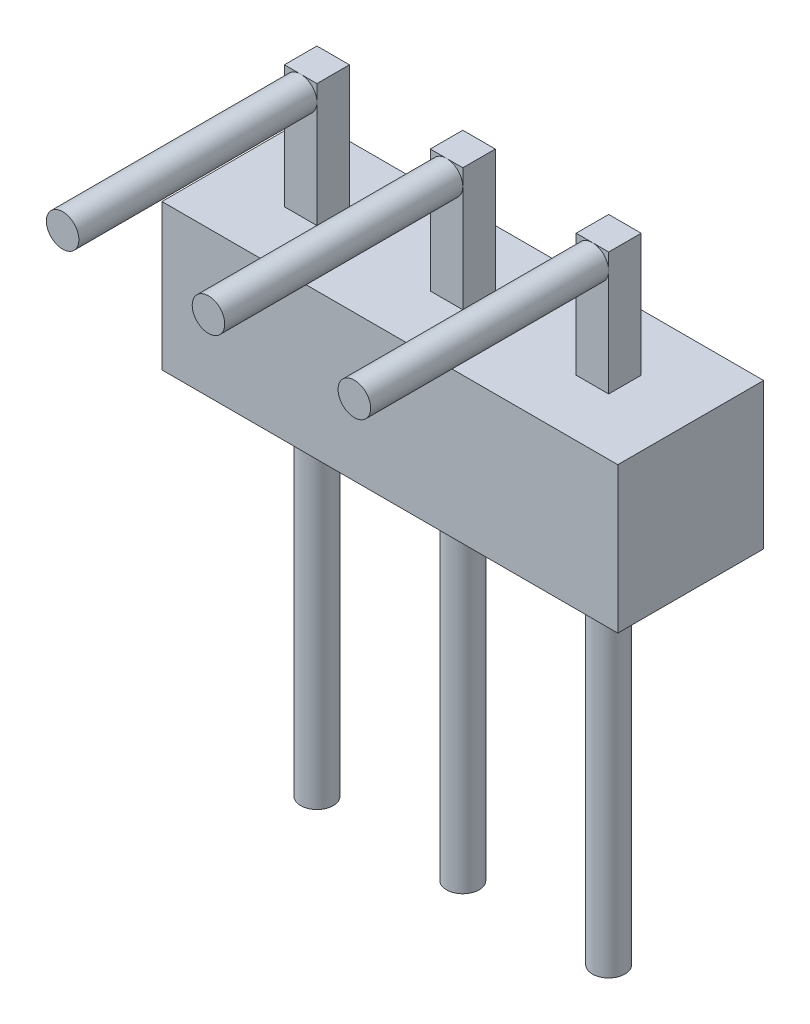
ISO-10303-21;
HEADER;
FILE_DESCRIPTION(('STEP AP214'),'2;1');
FILE_NAME('part.step','',(''),(''),'','','');
FILE_SCHEMA(('AUTOMOTIVE_DESIGN { 1 0 10303 214 1 1 1 1 }'));
ENDSEC;
DATA;
#1=APPLICATION_CONTEXT('core data for automotive mechanical design processes');
#2=APPLICATION_PROTOCOL_DEFINITION('international standard','automotive_design',2000,#1);
#3=PRODUCT_CONTEXT('',#1,'mechanical');
#4=PRODUCT('Part','Part','',(#3));
#5=PRODUCT_RELATED_PRODUCT_CATEGORY('part','',(#4));
#6=PRODUCT_DEFINITION_FORMATION('','',#4);
#7=PRODUCT_DEFINITION_CONTEXT('part definition',#1,'design');
#8=PRODUCT_DEFINITION('design','',#6,#7);
#9=PRODUCT_DEFINITION_SHAPE('','',#8);
#10=(LENGTH_UNIT() NAMED_UNIT(*) SI_UNIT(.MILLI.,.METRE.));
#11=(NAMED_UNIT(*) PLANE_ANGLE_UNIT() SI_UNIT($,.RADIAN.));
#12=(NAMED_UNIT(*) SI_UNIT($,.STERADIAN.) SOLID_ANGLE_UNIT());
#13=UNCERTAINTY_MEASURE_WITH_UNIT(LENGTH_MEASURE(1.E-05),#10,'distance_accuracy_value','');
#14=(GEOMETRIC_REPRESENTATION_CONTEXT(3) GLOBAL_UNCERTAINTY_ASSIGNED_CONTEXT((#13)) GLOBAL_UNIT_ASSIGNED_CONTEXT((#10,
#11,#12)) REPRESENTATION_CONTEXT('',''));
#15=CARTESIAN_POINT('',(0.,0.,0.));
#16=DIRECTION('',(0.,0.,1.));
#17=DIRECTION('',(1.,0.,0.));
#18=AXIS2_PLACEMENT_3D('',#15,#16,#17);
#19=CARTESIAN_POINT('',(2.54,3.12801,4.42849));
#20=DIRECTION('',(0.,0.,1.));
#21=DIRECTION('',(1.,0.,0.));
#22=AXIS2_PLACEMENT_3D('',#19,#20,#21);
#23=PLANE('',#22);
#24=CARTESIAN_POINT('',(2.54,3.12801,4.42849));
#25=DIRECTION('',(0.,0.,-1.));
#26=DIRECTION('',(-1.,0.,0.));
#27=AXIS2_PLACEMENT_3D('',#24,#25,#26);
#28=CIRCLE('',#27,0.28321);
#29=CARTESIAN_POINT('',(2.25679,3.12801,4.42849));
#30=VERTEX_POINT('',#29);
#31=EDGE_CURVE('E324',#30,#30,#28,.T.);
#32=ORIENTED_EDGE('',*,*,#31,.F.);
#33=EDGE_LOOP('',(#32));
#34=FACE_BOUND('',#33,.T.);
#35=ADVANCED_FACE('F17',(#34),#23,.T.);
#36=CARTESIAN_POINT('',(0.,3.12801,4.42849));
#37=DIRECTION('',(0.,0.,1.));
#38=DIRECTION('',(1.,0.,0.));
#39=AXIS2_PLACEMENT_3D('',#36,#37,#38);
#40=PLANE('',#39);
#41=CARTESIAN_POINT('',(0.,3.12801,4.42849));
#42=DIRECTION('',(0.,0.,-1.));
#43=DIRECTION('',(-1.,0.,0.));
#44=AXIS2_PLACEMENT_3D('',#41,#42,#43);
#45=CIRCLE('',#44,0.28321);
#46=CARTESIAN_POINT('',(-0.28321,3.12801,4.42849));
#47=VERTEX_POINT('',#46);
#48=EDGE_CURVE('E320',#47,#47,#45,.T.);
#49=ORIENTED_EDGE('',*,*,#48,.F.);
#50=EDGE_LOOP('',(#49));
#51=FACE_BOUND('',#50,.T.);
#52=ADVANCED_FACE('F595',(#51),#40,.T.);
#53=CARTESIAN_POINT('',(-2.54,3.12801,4.42849));
#54=DIRECTION('',(0.,0.,1.));
#55=DIRECTION('',(1.,0.,0.));
#56=AXIS2_PLACEMENT_3D('',#53,#54,#55);
#57=PLANE('',#56);
#58=CARTESIAN_POINT('',(-2.54,3.12801,4.42849));
#59=DIRECTION('',(0.,0.,-1.));
#60=DIRECTION('',(-1.,0.,0.));
#61=AXIS2_PLACEMENT_3D('',#58,#59,#60);
#62=CIRCLE('',#61,0.28321);
#63=CARTESIAN_POINT('',(-2.82321,3.12801,4.42849));
#64=VERTEX_POINT('',#63);
#65=EDGE_CURVE('E315',#64,#64,#62,.T.);
#66=ORIENTED_EDGE('',*,*,#65,.F.);
#67=EDGE_LOOP('',(#66));
#68=FACE_BOUND('',#67,.T.);
#69=ADVANCED_FACE('F593',(#68),#57,.T.);
#70=CARTESIAN_POINT('',(2.54,3.12801,4.42849));
#71=DIRECTION('',(0.,0.,-1.));
#72=DIRECTION('',(-1.,0.,0.));
#73=AXIS2_PLACEMENT_3D('',#70,#71,#72);
#74=CYLINDRICAL_SURFACE('',#73,0.28321);
#75=CARTESIAN_POINT('',(2.54,3.12801,0.28321));
#76=DIRECTION('',(0.,0.,-1.));
#77=DIRECTION('',(-1.,0.,0.));
#78=AXIS2_PLACEMENT_3D('',#75,#76,#77);
#79=CIRCLE('',#78,0.28321);
#80=CARTESIAN_POINT('',(2.25679,3.12801,0.28321));
#81=VERTEX_POINT('',#80);
#82=CARTESIAN_POINT('',(2.82321,3.12801,0.28321));
#83=VERTEX_POINT('',#82);
#84=EDGE_CURVE('E20',#81,#83,#79,.F.);
#85=ORIENTED_EDGE('',*,*,#84,.T.);
#86=CARTESIAN_POINT('',(2.54,3.12801,0.28321));
#87=DIRECTION('',(0.,0.,-1.));
#88=DIRECTION('',(-1.,0.,0.));
#89=AXIS2_PLACEMENT_3D('',#86,#87,#88);
#90=CIRCLE('',#89,0.28321);
#91=CARTESIAN_POINT('',(2.54,3.41122,0.28321));
#92=VERTEX_POINT('',#91);
#93=EDGE_CURVE('E171',#83,#92,#90,.F.);
#94=ORIENTED_EDGE('',*,*,#93,.T.);
#95=CARTESIAN_POINT('',(2.54,3.12801,0.28321));
#96=DIRECTION('',(0.,0.,-1.));
#97=DIRECTION('',(-1.,0.,0.));
#98=AXIS2_PLACEMENT_3D('',#95,#96,#97);
#99=CIRCLE('',#98,0.28321);
#100=EDGE_CURVE('E166',#92,#81,#99,.F.);
#101=ORIENTED_EDGE('',*,*,#100,.T.);
#102=EDGE_LOOP('',(#85,#94,#101));
#103=FACE_BOUND('',#102,.T.);
#104=ORIENTED_EDGE('',*,*,#31,.T.);
#105=EDGE_LOOP('',(#104));
#106=FACE_BOUND('',#105,.T.);
#107=ADVANCED_FACE('F168',(#103,#106),#74,.T.);
#108=CARTESIAN_POINT('',(0.,3.12801,4.42849));
#109=DIRECTION('',(0.,0.,-1.));
#110=DIRECTION('',(-1.,0.,0.));
#111=AXIS2_PLACEMENT_3D('',#108,#109,#110);
#112=CYLINDRICAL_SURFACE('',#111,0.28321);
#113=CARTESIAN_POINT('',(0.,3.12801,0.28321));
#114=DIRECTION('',(0.,0.,-1.));
#115=DIRECTION('',(-1.,0.,0.));
#116=AXIS2_PLACEMENT_3D('',#113,#114,#115);
#117=CIRCLE('',#116,0.28321);
#118=CARTESIAN_POINT('',(-0.28321,3.12801,0.28321));
#119=VERTEX_POINT('',#118);
#120=CARTESIAN_POINT('',(0.28321,3.12801,0.28321));
#121=VERTEX_POINT('',#120);
#122=EDGE_CURVE('E164',#119,#121,#117,.F.);
#123=ORIENTED_EDGE('',*,*,#122,.T.);
#124=CARTESIAN_POINT('',(0.,3.12801,0.28321));
#125=DIRECTION('',(0.,0.,-1.));
#126=DIRECTION('',(-1.,0.,0.));
#127=AXIS2_PLACEMENT_3D('',#124,#125,#126);
#128=CIRCLE('',#127,0.28321);
#129=CARTESIAN_POINT('',(0.,3.41122,0.28321));
#130=VERTEX_POINT('',#129);
#131=EDGE_CURVE('E318',#121,#130,#128,.F.);
#132=ORIENTED_EDGE('',*,*,#131,.T.);
#133=CARTESIAN_POINT('',(0.,3.12801,0.28321));
#134=DIRECTION('',(0.,0.,-1.));
#135=DIRECTION('',(-1.,0.,0.));
#136=AXIS2_PLACEMENT_3D('',#133,#134,#135);
#137=CIRCLE('',#136,0.28321);
#138=EDGE_CURVE('E242',#130,#119,#137,.F.);
#139=ORIENTED_EDGE('',*,*,#138,.T.);
#140=EDGE_LOOP('',(#123,#132,#139));
#141=FACE_BOUND('',#140,.T.);
#142=ORIENTED_EDGE('',*,*,#48,.T.);
#143=EDGE_LOOP('',(#142));
#144=FACE_BOUND('',#143,.T.);
#145=ADVANCED_FACE('F330',(#141,#144),#112,.T.);
#146=CARTESIAN_POINT('',(-2.54,3.12801,4.42849));
#147=DIRECTION('',(0.,0.,-1.));
#148=DIRECTION('',(-1.,0.,0.));
#149=AXIS2_PLACEMENT_3D('',#146,#147,#148);
#150=CYLINDRICAL_SURFACE('',#149,0.28321);
#151=CARTESIAN_POINT('',(-2.54,3.12801,0.28321));
#152=DIRECTION('',(0.,0.,-1.));
#153=DIRECTION('',(-1.,0.,0.));
#154=AXIS2_PLACEMENT_3D('',#151,#152,#153);
#155=CIRCLE('',#154,0.28321);
#156=CARTESIAN_POINT('',(-2.82321,3.12801,0.28321));
#157=VERTEX_POINT('',#156);
#158=CARTESIAN_POINT('',(-2.25679,3.12801,0.28321));
#159=VERTEX_POINT('',#158);
#160=EDGE_CURVE('E327',#157,#159,#155,.F.);
#161=ORIENTED_EDGE('',*,*,#160,.T.);
#162=CARTESIAN_POINT('',(-2.54,3.12801,0.28321));
#163=DIRECTION('',(0.,0.,-1.));
#164=DIRECTION('',(-1.,0.,0.));
#165=AXIS2_PLACEMENT_3D('',#162,#163,#164);
#166=CIRCLE('',#165,0.28321);
#167=CARTESIAN_POINT('',(-2.54,3.41122,0.28321));
#168=VERTEX_POINT('',#167);
#169=EDGE_CURVE('E176',#159,#168,#166,.F.);
#170=ORIENTED_EDGE('',*,*,#169,.T.);
#171=CARTESIAN_POINT('',(-2.54,3.12801,0.28321));
#172=DIRECTION('',(0.,0.,-1.));
#173=DIRECTION('',(-1.,0.,0.));
#174=AXIS2_PLACEMENT_3D('',#171,#172,#173);
#175=CIRCLE('',#174,0.28321);
#176=EDGE_CURVE('E221',#168,#157,#175,.F.);
#177=ORIENTED_EDGE('',*,*,#176,.T.);
#178=EDGE_LOOP('',(#161,#170,#177));
#179=FACE_BOUND('',#178,.T.);
#180=ORIENTED_EDGE('',*,*,#65,.T.);
#181=EDGE_LOOP('',(#180));
#182=FACE_BOUND('',#181,.T.);
#183=ADVANCED_FACE('F587',(#179,#182),#150,.T.);
#184=CARTESIAN_POINT('',(2.25679,3.41122,0.28321));
#185=DIRECTION('',(0.,0.,-1.));
#186=DIRECTION('',(-1.,0.,0.));
#187=AXIS2_PLACEMENT_3D('',#184,#185,#186);
#188=PLANE('',#187);
#189=DIRECTION('',(1.,0.,0.));
#190=VECTOR('',#189,1.);
#191=CARTESIAN_POINT('',(2.82321,3.41122,0.28321));
#192=LINE('',#191,#190);
#193=CARTESIAN_POINT('',(2.25679,3.41122,0.28321));
#194=VERTEX_POINT('',#193);
#195=EDGE_CURVE('E179',#92,#194,#192,.F.);
#196=ORIENTED_EDGE('',*,*,#195,.T.);
#197=DIRECTION('',(0.,1.,0.));
#198=VECTOR('',#197,1.);
#199=CARTESIAN_POINT('',(2.25679,3.41122,0.28321));
#200=LINE('',#199,#198);
#201=EDGE_CURVE('E175',#194,#81,#200,.F.);
#202=ORIENTED_EDGE('',*,*,#201,.T.);
#203=ORIENTED_EDGE('',*,*,#100,.F.);
#204=EDGE_LOOP('',(#196,#202,#203));
#205=FACE_BOUND('',#204,.T.);
#206=ADVANCED_FACE('F178',(#205),#188,.F.);
#207=CARTESIAN_POINT('',(2.25679,3.41122,0.28321));
#208=DIRECTION('',(1.,0.,0.));
#209=DIRECTION('',(0.,0.,-1.));
#210=AXIS2_PLACEMENT_3D('',#207,#208,#209);
#211=PLANE('',#210);
#212=DIRECTION('',(0.,1.,0.));
#213=VECTOR('',#212,1.);
#214=CARTESIAN_POINT('',(2.25679,3.41122,0.28321));
#215=LINE('',#214,#213);
#216=CARTESIAN_POINT('',(2.25679,1.27,0.28321));
#217=VERTEX_POINT('',#216);
#218=EDGE_CURVE('E158',#217,#81,#215,.T.);
#219=ORIENTED_EDGE('',*,*,#218,.T.);
#220=ORIENTED_EDGE('',*,*,#201,.F.);
#221=DIRECTION('',(0.,0.,-1.));
#222=VECTOR('',#221,1.);
#223=CARTESIAN_POINT('',(2.25679,3.41122,-0.28321));
#224=LINE('',#223,#222);
#225=CARTESIAN_POINT('',(2.25679,3.41122,-0.28321));
#226=VERTEX_POINT('',#225);
#227=EDGE_CURVE('E249',#194,#226,#224,.T.);
#228=ORIENTED_EDGE('',*,*,#227,.T.);
#229=DIRECTION('',(0.,1.,0.));
#230=VECTOR('',#229,1.);
#231=CARTESIAN_POINT('',(2.25679,3.41122,-0.28321));
#232=LINE('',#231,#230);
#233=CARTESIAN_POINT('',(2.25679,1.27,-0.28321));
#234=VERTEX_POINT('',#233);
#235=EDGE_CURVE('E284',#226,#234,#232,.F.);
#236=ORIENTED_EDGE('',*,*,#235,.T.);
#237=DIRECTION('',(0.,0.,-1.));
#238=VECTOR('',#237,1.);
#239=CARTESIAN_POINT('',(2.25679,1.27,0.28321));
#240=LINE('',#239,#238);
#241=EDGE_CURVE('E182',#217,#234,#240,.T.);
#242=ORIENTED_EDGE('',*,*,#241,.F.);
#243=EDGE_LOOP('',(#219,#220,#228,#236,#242));
#244=FACE_BOUND('',#243,.T.);
#245=ADVANCED_FACE('F184',(#244),#211,.F.);
#246=CARTESIAN_POINT('',(-0.28321,3.41122,0.28321));
#247=DIRECTION('',(0.,0.,-1.));
#248=DIRECTION('',(-1.,0.,0.));
#249=AXIS2_PLACEMENT_3D('',#246,#247,#248);
#250=PLANE('',#249);
#251=DIRECTION('',(1.,0.,0.));
#252=VECTOR('',#251,1.);
#253=CARTESIAN_POINT('',(0.28321,3.41122,0.28321));
#254=LINE('',#253,#252);
#255=CARTESIAN_POINT('',(-0.28321,3.41122,0.28321));
#256=VERTEX_POINT('',#255);
#257=EDGE_CURVE('E227',#130,#256,#254,.F.);
#258=ORIENTED_EDGE('',*,*,#257,.T.);
#259=DIRECTION('',(0.,1.,0.));
#260=VECTOR('',#259,1.);
#261=CARTESIAN_POINT('',(-0.28321,3.41122,0.28321));
#262=LINE('',#261,#260);
#263=EDGE_CURVE('E238',#256,#119,#262,.F.);
#264=ORIENTED_EDGE('',*,*,#263,.T.);
#265=ORIENTED_EDGE('',*,*,#138,.F.);
#266=EDGE_LOOP('',(#258,#264,#265));
#267=FACE_BOUND('',#266,.T.);
#268=ADVANCED_FACE('F458',(#267),#250,.F.);
#269=CARTESIAN_POINT('',(-0.28321,3.41122,0.28321));
#270=DIRECTION('',(1.,0.,0.));
#271=DIRECTION('',(0.,0.,-1.));
#272=AXIS2_PLACEMENT_3D('',#269,#270,#271);
#273=PLANE('',#272);
#274=DIRECTION('',(0.,1.,0.));
#275=VECTOR('',#274,1.);
#276=CARTESIAN_POINT('',(-0.28321,3.41122,0.28321));
#277=LINE('',#276,#275);
#278=CARTESIAN_POINT('',(-0.28321,1.27,0.28321));
#279=VERTEX_POINT('',#278);
#280=EDGE_CURVE('E359',#279,#119,#277,.T.);
#281=ORIENTED_EDGE('',*,*,#280,.T.);
#282=ORIENTED_EDGE('',*,*,#263,.F.);
#283=DIRECTION('',(0.,0.,-1.));
#284=VECTOR('',#283,1.);
#285=CARTESIAN_POINT('',(-0.28321,3.41122,-0.28321));
#286=LINE('',#285,#284);
#287=CARTESIAN_POINT('',(-0.28321,3.41122,-0.28321));
#288=VERTEX_POINT('',#287);
#289=EDGE_CURVE('E230',#256,#288,#286,.T.);
#290=ORIENTED_EDGE('',*,*,#289,.T.);
#291=DIRECTION('',(0.,1.,0.));
#292=VECTOR('',#291,1.);
#293=CARTESIAN_POINT('',(-0.28321,3.41122,-0.28321));
#294=LINE('',#293,#292);
#295=CARTESIAN_POINT('',(-0.28321,1.27,-0.28321));
#296=VERTEX_POINT('',#295);
#297=EDGE_CURVE('E274',#288,#296,#294,.F.);
#298=ORIENTED_EDGE('',*,*,#297,.T.);
#299=DIRECTION('',(0.,0.,-1.));
#300=VECTOR('',#299,1.);
#301=CARTESIAN_POINT('',(-0.28321,1.27,0.28321));
#302=LINE('',#301,#300);
#303=EDGE_CURVE('E241',#279,#296,#302,.T.);
#304=ORIENTED_EDGE('',*,*,#303,.F.);
#305=EDGE_LOOP('',(#281,#282,#290,#298,#304));
#306=FACE_BOUND('',#305,.T.);
#307=ADVANCED_FACE('F454',(#306),#273,.F.);
#308=CARTESIAN_POINT('',(-2.82321,3.41122,0.28321));
#309=DIRECTION('',(0.,0.,-1.));
#310=DIRECTION('',(-1.,0.,0.));
#311=AXIS2_PLACEMENT_3D('',#308,#309,#310);
#312=PLANE('',#311);
#313=DIRECTION('',(1.,0.,0.));
#314=VECTOR('',#313,1.);
#315=CARTESIAN_POINT('',(-2.25679,3.41122,0.28321));
#316=LINE('',#315,#314);
#317=CARTESIAN_POINT('',(-2.82321,3.41122,0.28321));
#318=VERTEX_POINT('',#317);
#319=EDGE_CURVE('E207',#168,#318,#316,.F.);
#320=ORIENTED_EDGE('',*,*,#319,.T.);
#321=DIRECTION('',(0.,1.,0.));
#322=VECTOR('',#321,1.);
#323=CARTESIAN_POINT('',(-2.82321,3.41122,0.28321));
#324=LINE('',#323,#322);
#325=EDGE_CURVE('E218',#318,#157,#324,.F.);
#326=ORIENTED_EDGE('',*,*,#325,.T.);
#327=ORIENTED_EDGE('',*,*,#176,.F.);
#328=EDGE_LOOP('',(#320,#326,#327));
#329=FACE_BOUND('',#328,.T.);
#330=ADVANCED_FACE('F466',(#329),#312,.F.);
#331=CARTESIAN_POINT('',(-2.82321,3.41122,0.28321));
#332=DIRECTION('',(1.,0.,0.));
#333=DIRECTION('',(0.,0.,-1.));
#334=AXIS2_PLACEMENT_3D('',#331,#332,#333);
#335=PLANE('',#334);
#336=DIRECTION('',(0.,1.,0.));
#337=VECTOR('',#336,1.);
#338=CARTESIAN_POINT('',(-2.82321,3.41122,0.28321));
#339=LINE('',#338,#337);
#340=CARTESIAN_POINT('',(-2.82321,1.27,0.28321));
#341=VERTEX_POINT('',#340);
#342=EDGE_CURVE('E424',#341,#157,#339,.T.);
#343=ORIENTED_EDGE('',*,*,#342,.T.);
#344=ORIENTED_EDGE('',*,*,#325,.F.);
#345=DIRECTION('',(0.,0.,-1.));
#346=VECTOR('',#345,1.);
#347=CARTESIAN_POINT('',(-2.82321,3.41122,-0.28321));
#348=LINE('',#347,#346);
#349=CARTESIAN_POINT('',(-2.82321,3.41122,-0.28321));
#350=VERTEX_POINT('',#349);
#351=EDGE_CURVE('E210',#318,#350,#348,.T.);
#352=ORIENTED_EDGE('',*,*,#351,.T.);
#353=DIRECTION('',(0.,1.,0.));
#354=VECTOR('',#353,1.);
#355=CARTESIAN_POINT('',(-2.82321,3.41122,-0.28321));
#356=LINE('',#355,#354);
#357=CARTESIAN_POINT('',(-2.82321,1.27,-0.28321));
#358=VERTEX_POINT('',#357);
#359=EDGE_CURVE('E264',#350,#358,#356,.F.);
#360=ORIENTED_EDGE('',*,*,#359,.T.);
#361=DIRECTION('',(0.,0.,-1.));
#362=VECTOR('',#361,1.);
#363=CARTESIAN_POINT('',(-2.82321,1.27,0.28321));
#364=LINE('',#363,#362);
#365=EDGE_CURVE('E191',#341,#358,#364,.T.);
#366=ORIENTED_EDGE('',*,*,#365,.F.);
#367=EDGE_LOOP('',(#343,#344,#352,#360,#366));
#368=FACE_BOUND('',#367,.T.);
#369=ADVANCED_FACE('F564',(#368),#335,.F.);
#370=CARTESIAN_POINT('',(0.,-7.62,0.));
#371=DIRECTION('',(0.,-1.,0.));
#372=DIRECTION('',(0.,0.,-1.));
#373=AXIS2_PLACEMENT_3D('',#370,#371,#372);
#374=PLANE('',#373);
#375=CARTESIAN_POINT('',(0.,-7.62,0.));
#376=DIRECTION('',(0.,1.,0.));
#377=DIRECTION('',(0.,0.,1.));
#378=AXIS2_PLACEMENT_3D('',#375,#376,#377);
#379=CIRCLE('',#378,0.28321);
#380=CARTESIAN_POINT('',(0.,-7.62,0.28321));
#381=VERTEX_POINT('',#380);
#382=EDGE_CURVE('E263',#381,#381,#379,.T.);
#383=ORIENTED_EDGE('',*,*,#382,.F.);
#384=EDGE_LOOP('',(#383));
#385=FACE_BOUND('',#384,.T.);
#386=ADVANCED_FACE('F560',(#385),#374,.T.);
#387=CARTESIAN_POINT('',(-2.54,-7.62,0.));
#388=DIRECTION('',(0.,-1.,0.));
#389=DIRECTION('',(0.,0.,-1.));
#390=AXIS2_PLACEMENT_3D('',#387,#388,#389);
#391=PLANE('',#390);
#392=CARTESIAN_POINT('',(-2.54,-7.62,0.));
#393=DIRECTION('',(0.,1.,0.));
#394=DIRECTION('',(0.,0.,1.));
#395=AXIS2_PLACEMENT_3D('',#392,#393,#394);
#396=CIRCLE('',#395,0.28321);
#397=CARTESIAN_POINT('',(-2.54,-7.62,0.28321));
#398=VERTEX_POINT('',#397);
#399=EDGE_CURVE('E305',#398,#398,#396,.T.);
#400=ORIENTED_EDGE('',*,*,#399,.F.);
#401=EDGE_LOOP('',(#400));
#402=FACE_BOUND('',#401,.T.);
#403=ADVANCED_FACE('F556',(#402),#391,.T.);
#404=CARTESIAN_POINT('',(2.54,-7.62,0.));
#405=DIRECTION('',(0.,-1.,0.));
#406=DIRECTION('',(0.,0.,-1.));
#407=AXIS2_PLACEMENT_3D('',#404,#405,#406);
#408=PLANE('',#407);
#409=CARTESIAN_POINT('',(2.54,-7.62,0.));
#410=DIRECTION('',(0.,1.,0.));
#411=DIRECTION('',(0.,0.,1.));
#412=AXIS2_PLACEMENT_3D('',#409,#410,#411);
#413=CIRCLE('',#412,0.28321);
#414=CARTESIAN_POINT('',(2.54,-7.62,0.28321));
#415=VERTEX_POINT('',#414);
#416=EDGE_CURVE('E302',#415,#415,#413,.T.);
#417=ORIENTED_EDGE('',*,*,#416,.F.);
#418=EDGE_LOOP('',(#417));
#419=FACE_BOUND('',#418,.T.);
#420=ADVANCED_FACE('F553',(#419),#408,.T.);
#421=CARTESIAN_POINT('',(2.25679,3.41122,0.28321));
#422=DIRECTION('',(0.,0.,-1.));
#423=DIRECTION('',(-1.,0.,0.));
#424=AXIS2_PLACEMENT_3D('',#421,#422,#423);
#425=PLANE('',#424);
#426=ORIENTED_EDGE('',*,*,#218,.F.);
#427=DIRECTION('',(-1.,0.,0.));
#428=VECTOR('',#427,1.);
#429=CARTESIAN_POINT('',(2.25679,1.27,0.28321));
#430=LINE('',#429,#428);
#431=CARTESIAN_POINT('',(2.82321,1.27,0.28321));
#432=VERTEX_POINT('',#431);
#433=EDGE_CURVE('E187',#432,#217,#430,.T.);
#434=ORIENTED_EDGE('',*,*,#433,.F.);
#435=DIRECTION('',(0.,1.,0.));
#436=VECTOR('',#435,1.);
#437=CARTESIAN_POINT('',(2.82321,3.41122,0.28321));
#438=LINE('',#437,#436);
#439=EDGE_CURVE('E161',#432,#83,#438,.T.);
#440=ORIENTED_EDGE('',*,*,#439,.T.);
#441=ORIENTED_EDGE('',*,*,#84,.F.);
#442=EDGE_LOOP('',(#426,#434,#440,#441));
#443=FACE_BOUND('',#442,.T.);
#444=ADVANCED_FACE('F156',(#443),#425,.F.);
#445=CARTESIAN_POINT('',(2.25679,3.41122,0.28321));
#446=DIRECTION('',(0.,0.,-1.));
#447=DIRECTION('',(-1.,0.,0.));
#448=AXIS2_PLACEMENT_3D('',#445,#446,#447);
#449=PLANE('',#448);
#450=DIRECTION('',(0.,1.,0.));
#451=VECTOR('',#450,1.);
#452=CARTESIAN_POINT('',(2.82321,3.41122,0.28321));
#453=LINE('',#452,#451);
#454=CARTESIAN_POINT('',(2.82321,3.41122,0.28321));
#455=VERTEX_POINT('',#454);
#456=EDGE_CURVE('E383',#83,#455,#453,.T.);
#457=ORIENTED_EDGE('',*,*,#456,.T.);
#458=DIRECTION('',(1.,0.,0.));
#459=VECTOR('',#458,1.);
#460=CARTESIAN_POINT('',(2.82321,3.41122,0.28321));
#461=LINE('',#460,#459);
#462=EDGE_CURVE('E186',#455,#92,#461,.F.);
#463=ORIENTED_EDGE('',*,*,#462,.T.);
#464=ORIENTED_EDGE('',*,*,#93,.F.);
#465=EDGE_LOOP('',(#457,#463,#464));
#466=FACE_BOUND('',#465,.T.);
#467=ADVANCED_FACE('F547',(#466),#449,.F.);
#468=CARTESIAN_POINT('',(2.82321,3.41122,-0.28321));
#469=DIRECTION('',(0.,-1.,0.));
#470=DIRECTION('',(0.,0.,-1.));
#471=AXIS2_PLACEMENT_3D('',#468,#469,#470);
#472=PLANE('',#471);
#473=DIRECTION('',(1.,0.,0.));
#474=VECTOR('',#473,1.);
#475=CARTESIAN_POINT('',(2.25679,3.41122,-0.28321));
#476=LINE('',#475,#474);
#477=CARTESIAN_POINT('',(2.82321,3.41122,-0.28321));
#478=VERTEX_POINT('',#477);
#479=EDGE_CURVE('E253',#478,#226,#476,.F.);
#480=ORIENTED_EDGE('',*,*,#479,.T.);
#481=ORIENTED_EDGE('',*,*,#227,.F.);
#482=ORIENTED_EDGE('',*,*,#195,.F.);
#483=ORIENTED_EDGE('',*,*,#462,.F.);
#484=DIRECTION('',(0.,0.,1.));
#485=VECTOR('',#484,1.);
#486=CARTESIAN_POINT('',(2.82321,3.41122,0.28321));
#487=LINE('',#486,#485);
#488=EDGE_CURVE('E388',#455,#478,#487,.F.);
#489=ORIENTED_EDGE('',*,*,#488,.T.);
#490=EDGE_LOOP('',(#480,#481,#482,#483,#489));
#491=FACE_BOUND('',#490,.T.);
#492=ADVANCED_FACE('F544',(#491),#472,.F.);
#493=CARTESIAN_POINT('',(2.25679,3.41122,-0.28321));
#494=DIRECTION('',(0.,0.,1.));
#495=DIRECTION('',(1.,0.,0.));
#496=AXIS2_PLACEMENT_3D('',#493,#494,#495);
#497=PLANE('',#496);
#498=ORIENTED_EDGE('',*,*,#235,.F.);
#499=ORIENTED_EDGE('',*,*,#479,.F.);
#500=DIRECTION('',(0.,1.,0.));
#501=VECTOR('',#500,1.);
#502=CARTESIAN_POINT('',(2.82321,3.41122,-0.28321));
#503=LINE('',#502,#501);
#504=CARTESIAN_POINT('',(2.82321,1.27,-0.28321));
#505=VERTEX_POINT('',#504);
#506=EDGE_CURVE('E345',#478,#505,#503,.F.);
#507=ORIENTED_EDGE('',*,*,#506,.T.);
#508=DIRECTION('',(1.,0.,0.));
#509=VECTOR('',#508,1.);
#510=CARTESIAN_POINT('',(2.25679,1.27,-0.28321));
#511=LINE('',#510,#509);
#512=EDGE_CURVE('E281',#234,#505,#511,.T.);
#513=ORIENTED_EDGE('',*,*,#512,.F.);
#514=EDGE_LOOP('',(#498,#499,#507,#513));
#515=FACE_BOUND('',#514,.T.);
#516=ADVANCED_FACE('F541',(#515),#497,.F.);
#517=CARTESIAN_POINT('',(-0.28321,3.41122,0.28321));
#518=DIRECTION('',(0.,0.,-1.));
#519=DIRECTION('',(-1.,0.,0.));
#520=AXIS2_PLACEMENT_3D('',#517,#518,#519);
#521=PLANE('',#520);
#522=ORIENTED_EDGE('',*,*,#280,.F.);
#523=DIRECTION('',(-1.,0.,0.));
#524=VECTOR('',#523,1.);
#525=CARTESIAN_POINT('',(-0.28321,1.27,0.28321));
#526=LINE('',#525,#524);
#527=CARTESIAN_POINT('',(0.28321,1.27,0.28321));
#528=VERTEX_POINT('',#527);
#529=EDGE_CURVE('E283',#528,#279,#526,.T.);
#530=ORIENTED_EDGE('',*,*,#529,.F.);
#531=DIRECTION('',(0.,1.,0.));
#532=VECTOR('',#531,1.);
#533=CARTESIAN_POINT('',(0.28321,3.41122,0.28321));
#534=LINE('',#533,#532);
#535=EDGE_CURVE('E337',#528,#121,#534,.T.);
#536=ORIENTED_EDGE('',*,*,#535,.T.);
#537=ORIENTED_EDGE('',*,*,#122,.F.);
#538=EDGE_LOOP('',(#522,#530,#536,#537));
#539=FACE_BOUND('',#538,.T.);
#540=ADVANCED_FACE('F339',(#539),#521,.F.);
#541=CARTESIAN_POINT('',(-0.28321,3.41122,0.28321));
#542=DIRECTION('',(0.,0.,-1.));
#543=DIRECTION('',(-1.,0.,0.));
#544=AXIS2_PLACEMENT_3D('',#541,#542,#543);
#545=PLANE('',#544);
#546=DIRECTION('',(0.,1.,0.));
#547=VECTOR('',#546,1.);
#548=CARTESIAN_POINT('',(0.28321,3.41122,0.28321));
#549=LINE('',#548,#547);
#550=CARTESIAN_POINT('',(0.28321,3.41122,0.28321));
#551=VERTEX_POINT('',#550);
#552=EDGE_CURVE('E344',#121,#551,#549,.T.);
#553=ORIENTED_EDGE('',*,*,#552,.T.);
#554=DIRECTION('',(1.,0.,0.));
#555=VECTOR('',#554,1.);
#556=CARTESIAN_POINT('',(0.28321,3.41122,0.28321));
#557=LINE('',#556,#555);
#558=EDGE_CURVE('E231',#551,#130,#557,.F.);
#559=ORIENTED_EDGE('',*,*,#558,.T.);
#560=ORIENTED_EDGE('',*,*,#131,.F.);
#561=EDGE_LOOP('',(#553,#559,#560));
#562=FACE_BOUND('',#561,.T.);
#563=ADVANCED_FACE('F356',(#562),#545,.F.);
#564=CARTESIAN_POINT('',(0.28321,3.41122,-0.28321));
#565=DIRECTION('',(0.,-1.,0.));
#566=DIRECTION('',(0.,0.,-1.));
#567=AXIS2_PLACEMENT_3D('',#564,#565,#566);
#568=PLANE('',#567);
#569=DIRECTION('',(1.,0.,0.));
#570=VECTOR('',#569,1.);
#571=CARTESIAN_POINT('',(-0.28321,3.41122,-0.28321));
#572=LINE('',#571,#570);
#573=CARTESIAN_POINT('',(0.28321,3.41122,-0.28321));
#574=VERTEX_POINT('',#573);
#575=EDGE_CURVE('E235',#574,#288,#572,.F.);
#576=ORIENTED_EDGE('',*,*,#575,.T.);
#577=ORIENTED_EDGE('',*,*,#289,.F.);
#578=ORIENTED_EDGE('',*,*,#257,.F.);
#579=ORIENTED_EDGE('',*,*,#558,.F.);
#580=DIRECTION('',(0.,0.,1.));
#581=VECTOR('',#580,1.);
#582=CARTESIAN_POINT('',(0.28321,3.41122,0.28321));
#583=LINE('',#582,#581);
#584=EDGE_CURVE('E352',#551,#574,#583,.F.);
#585=ORIENTED_EDGE('',*,*,#584,.T.);
#586=EDGE_LOOP('',(#576,#577,#578,#579,#585));
#587=FACE_BOUND('',#586,.T.);
#588=ADVANCED_FACE('F456',(#587),#568,.F.);
#589=CARTESIAN_POINT('',(-0.28321,3.41122,-0.28321));
#590=DIRECTION('',(0.,0.,1.));
#591=DIRECTION('',(1.,0.,0.));
#592=AXIS2_PLACEMENT_3D('',#589,#590,#591);
#593=PLANE('',#592);
#594=ORIENTED_EDGE('',*,*,#297,.F.);
#595=ORIENTED_EDGE('',*,*,#575,.F.);
#596=DIRECTION('',(0.,1.,0.));
#597=VECTOR('',#596,1.);
#598=CARTESIAN_POINT('',(0.28321,3.41122,-0.28321));
#599=LINE('',#598,#597);
#600=CARTESIAN_POINT('',(0.28321,1.27,-0.28321));
#601=VERTEX_POINT('',#600);
#602=EDGE_CURVE('E403',#574,#601,#599,.F.);
#603=ORIENTED_EDGE('',*,*,#602,.T.);
#604=DIRECTION('',(1.,0.,0.));
#605=VECTOR('',#604,1.);
#606=CARTESIAN_POINT('',(-0.28321,1.27,-0.28321));
#607=LINE('',#606,#605);
#608=EDGE_CURVE('E271',#296,#601,#607,.T.);
#609=ORIENTED_EDGE('',*,*,#608,.F.);
#610=EDGE_LOOP('',(#594,#595,#603,#609));
#611=FACE_BOUND('',#610,.T.);
#612=ADVANCED_FACE('F449',(#611),#593,.F.);
#613=CARTESIAN_POINT('',(-2.82321,3.41122,0.28321));
#614=DIRECTION('',(0.,0.,-1.));
#615=DIRECTION('',(-1.,0.,0.));
#616=AXIS2_PLACEMENT_3D('',#613,#614,#615);
#617=PLANE('',#616);
#618=ORIENTED_EDGE('',*,*,#342,.F.);
#619=DIRECTION('',(-1.,0.,0.));
#620=VECTOR('',#619,1.);
#621=CARTESIAN_POINT('',(-2.82321,1.27,0.28321));
#622=LINE('',#621,#620);
#623=CARTESIAN_POINT('',(-2.25679,1.27,0.28321));
#624=VERTEX_POINT('',#623);
#625=EDGE_CURVE('E273',#624,#341,#622,.T.);
#626=ORIENTED_EDGE('',*,*,#625,.F.);
#627=DIRECTION('',(0.,1.,0.));
#628=VECTOR('',#627,1.);
#629=CARTESIAN_POINT('',(-2.25679,3.41122,0.28321));
#630=LINE('',#629,#628);
#631=EDGE_CURVE('E407',#624,#159,#630,.T.);
#632=ORIENTED_EDGE('',*,*,#631,.T.);
#633=ORIENTED_EDGE('',*,*,#160,.F.);
#634=EDGE_LOOP('',(#618,#626,#632,#633));
#635=FACE_BOUND('',#634,.T.);
#636=ADVANCED_FACE('F528',(#635),#617,.F.);
#637=CARTESIAN_POINT('',(-2.82321,3.41122,0.28321));
#638=DIRECTION('',(0.,0.,-1.));
#639=DIRECTION('',(-1.,0.,0.));
#640=AXIS2_PLACEMENT_3D('',#637,#638,#639);
#641=PLANE('',#640);
#642=DIRECTION('',(0.,1.,0.));
#643=VECTOR('',#642,1.);
#644=CARTESIAN_POINT('',(-2.25679,3.41122,0.28321));
#645=LINE('',#644,#643);
#646=CARTESIAN_POINT('',(-2.25679,3.41122,0.28321));
#647=VERTEX_POINT('',#646);
#648=EDGE_CURVE('E410',#159,#647,#645,.T.);
#649=ORIENTED_EDGE('',*,*,#648,.T.);
#650=DIRECTION('',(1.,0.,0.));
#651=VECTOR('',#650,1.);
#652=CARTESIAN_POINT('',(-2.25679,3.41122,0.28321));
#653=LINE('',#652,#651);
#654=EDGE_CURVE('E211',#647,#168,#653,.F.);
#655=ORIENTED_EDGE('',*,*,#654,.T.);
#656=ORIENTED_EDGE('',*,*,#169,.F.);
#657=EDGE_LOOP('',(#649,#655,#656));
#658=FACE_BOUND('',#657,.T.);
#659=ADVANCED_FACE('F524',(#658),#641,.F.);
#660=CARTESIAN_POINT('',(-2.25679,3.41122,-0.28321));
#661=DIRECTION('',(0.,-1.,0.));
#662=DIRECTION('',(0.,0.,-1.));
#663=AXIS2_PLACEMENT_3D('',#660,#661,#662);
#664=PLANE('',#663);
#665=DIRECTION('',(1.,0.,0.));
#666=VECTOR('',#665,1.);
#667=CARTESIAN_POINT('',(-2.82321,3.41122,-0.28321));
#668=LINE('',#667,#666);
#669=CARTESIAN_POINT('',(-2.25679,3.41122,-0.28321));
#670=VERTEX_POINT('',#669);
#671=EDGE_CURVE('E215',#670,#350,#668,.F.);
#672=ORIENTED_EDGE('',*,*,#671,.T.);
#673=ORIENTED_EDGE('',*,*,#351,.F.);
#674=ORIENTED_EDGE('',*,*,#319,.F.);
#675=ORIENTED_EDGE('',*,*,#654,.F.);
#676=DIRECTION('',(0.,0.,1.));
#677=VECTOR('',#676,1.);
#678=CARTESIAN_POINT('',(-2.25679,3.41122,0.28321));
#679=LINE('',#678,#677);
#680=EDGE_CURVE('E415',#647,#670,#679,.F.);
#681=ORIENTED_EDGE('',*,*,#680,.T.);
#682=EDGE_LOOP('',(#672,#673,#674,#675,#681));
#683=FACE_BOUND('',#682,.T.);
#684=ADVANCED_FACE('F520',(#683),#664,.F.);
#685=CARTESIAN_POINT('',(-2.82321,3.41122,-0.28321));
#686=DIRECTION('',(0.,0.,1.));
#687=DIRECTION('',(1.,0.,0.));
#688=AXIS2_PLACEMENT_3D('',#685,#686,#687);
#689=PLANE('',#688);
#690=ORIENTED_EDGE('',*,*,#359,.F.);
#691=ORIENTED_EDGE('',*,*,#671,.F.);
#692=DIRECTION('',(0.,1.,0.));
#693=VECTOR('',#692,1.);
#694=CARTESIAN_POINT('',(-2.25679,3.41122,-0.28321));
#695=LINE('',#694,#693);
#696=CARTESIAN_POINT('',(-2.25679,1.27,-0.28321));
#697=VERTEX_POINT('',#696);
#698=EDGE_CURVE('E301',#670,#697,#695,.F.);
#699=ORIENTED_EDGE('',*,*,#698,.T.);
#700=DIRECTION('',(1.,0.,0.));
#701=VECTOR('',#700,1.);
#702=CARTESIAN_POINT('',(-2.82321,1.27,-0.28321));
#703=LINE('',#702,#701);
#704=EDGE_CURVE('E261',#358,#697,#703,.T.);
#705=ORIENTED_EDGE('',*,*,#704,.F.);
#706=EDGE_LOOP('',(#690,#691,#699,#705));
#707=FACE_BOUND('',#706,.T.);
#708=ADVANCED_FACE('F516',(#707),#689,.F.);
#709=CARTESIAN_POINT('',(0.,-7.62,0.));
#710=DIRECTION('',(0.,1.,0.));
#711=DIRECTION('',(0.,0.,1.));
#712=AXIS2_PLACEMENT_3D('',#709,#710,#711);
#713=CYLINDRICAL_SURFACE('',#712,0.28321);
#714=ORIENTED_EDGE('',*,*,#382,.T.);
#715=EDGE_LOOP('',(#714));
#716=FACE_BOUND('',#715,.T.);
#717=CARTESIAN_POINT('',(0.,-1.27,0.));
#718=DIRECTION('',(0.,1.,0.));
#719=DIRECTION('',(0.,0.,1.));
#720=AXIS2_PLACEMENT_3D('',#717,#718,#719);
#721=CIRCLE('',#720,0.28321);
#722=CARTESIAN_POINT('',(0.,-1.27,0.28321));
#723=VERTEX_POINT('',#722);
#724=EDGE_CURVE('E298',#723,#723,#721,.F.);
#725=ORIENTED_EDGE('',*,*,#724,.T.);
#726=EDGE_LOOP('',(#725));
#727=FACE_BOUND('',#726,.T.);
#728=ADVANCED_FACE('F512',(#716,#727),#713,.T.);
#729=CARTESIAN_POINT('',(-2.54,-7.62,0.));
#730=DIRECTION('',(0.,1.,0.));
#731=DIRECTION('',(0.,0.,1.));
#732=AXIS2_PLACEMENT_3D('',#729,#730,#731);
#733=CYLINDRICAL_SURFACE('',#732,0.28321);
#734=ORIENTED_EDGE('',*,*,#399,.T.);
#735=EDGE_LOOP('',(#734));
#736=FACE_BOUND('',#735,.T.);
#737=CARTESIAN_POINT('',(-2.54,-1.27,0.));
#738=DIRECTION('',(0.,1.,0.));
#739=DIRECTION('',(0.,0.,1.));
#740=AXIS2_PLACEMENT_3D('',#737,#738,#739);
#741=CIRCLE('',#740,0.28321);
#742=CARTESIAN_POINT('',(-2.54,-1.27,0.28321));
#743=VERTEX_POINT('',#742);
#744=EDGE_CURVE('E294',#743,#743,#741,.F.);
#745=ORIENTED_EDGE('',*,*,#744,.T.);
#746=EDGE_LOOP('',(#745));
#747=FACE_BOUND('',#746,.T.);
#748=ADVANCED_FACE('F508',(#736,#747),#733,.T.);
#749=CARTESIAN_POINT('',(2.54,-7.62,0.));
#750=DIRECTION('',(0.,1.,0.));
#751=DIRECTION('',(0.,0.,1.));
#752=AXIS2_PLACEMENT_3D('',#749,#750,#751);
#753=CYLINDRICAL_SURFACE('',#752,0.28321);
#754=ORIENTED_EDGE('',*,*,#416,.T.);
#755=EDGE_LOOP('',(#754));
#756=FACE_BOUND('',#755,.T.);
#757=CARTESIAN_POINT('',(2.54,-1.27,0.));
#758=DIRECTION('',(0.,1.,0.));
#759=DIRECTION('',(0.,0.,1.));
#760=AXIS2_PLACEMENT_3D('',#757,#758,#759);
#761=CIRCLE('',#760,0.28321);
#762=CARTESIAN_POINT('',(2.54,-1.27,0.28321));
#763=VERTEX_POINT('',#762);
#764=EDGE_CURVE('E290',#763,#763,#761,.F.);
#765=ORIENTED_EDGE('',*,*,#764,.T.);
#766=EDGE_LOOP('',(#765));
#767=FACE_BOUND('',#766,.T.);
#768=ADVANCED_FACE('F504',(#756,#767),#753,.T.);
#769=CARTESIAN_POINT('',(2.82321,3.41122,0.28321));
#770=DIRECTION('',(-1.,0.,0.));
#771=DIRECTION('',(0.,0.,1.));
#772=AXIS2_PLACEMENT_3D('',#769,#770,#771);
#773=PLANE('',#772);
#774=ORIENTED_EDGE('',*,*,#506,.F.);
#775=ORIENTED_EDGE('',*,*,#488,.F.);
#776=ORIENTED_EDGE('',*,*,#456,.F.);
#777=ORIENTED_EDGE('',*,*,#439,.F.);
#778=DIRECTION('',(0.,0.,-1.));
#779=VECTOR('',#778,1.);
#780=CARTESIAN_POINT('',(2.82321,1.27,1.27));
#781=LINE('',#780,#779);
#782=EDGE_CURVE('E200',#432,#505,#781,.T.);
#783=ORIENTED_EDGE('',*,*,#782,.T.);
#784=EDGE_LOOP('',(#774,#775,#776,#777,#783));
#785=FACE_BOUND('',#784,.T.);
#786=ADVANCED_FACE('F501',(#785),#773,.F.);
#787=CARTESIAN_POINT('',(0.28321,3.41122,0.28321));
#788=DIRECTION('',(-1.,0.,0.));
#789=DIRECTION('',(0.,0.,1.));
#790=AXIS2_PLACEMENT_3D('',#787,#788,#789);
#791=PLANE('',#790);
#792=ORIENTED_EDGE('',*,*,#602,.F.);
#793=ORIENTED_EDGE('',*,*,#584,.F.);
#794=ORIENTED_EDGE('',*,*,#552,.F.);
#795=ORIENTED_EDGE('',*,*,#535,.F.);
#796=DIRECTION('',(0.,0.,-1.));
#797=VECTOR('',#796,1.);
#798=CARTESIAN_POINT('',(0.28321,1.27,1.27));
#799=LINE('',#798,#797);
#800=EDGE_CURVE('E374',#528,#601,#799,.T.);
#801=ORIENTED_EDGE('',*,*,#800,.T.);
#802=EDGE_LOOP('',(#792,#793,#794,#795,#801));
#803=FACE_BOUND('',#802,.T.);
#804=ADVANCED_FACE('F350',(#803),#791,.F.);
#805=CARTESIAN_POINT('',(-2.25679,3.41122,0.28321));
#806=DIRECTION('',(-1.,0.,0.));
#807=DIRECTION('',(0.,0.,1.));
#808=AXIS2_PLACEMENT_3D('',#805,#806,#807);
#809=PLANE('',#808);
#810=ORIENTED_EDGE('',*,*,#698,.F.);
#811=ORIENTED_EDGE('',*,*,#680,.F.);
#812=ORIENTED_EDGE('',*,*,#648,.F.);
#813=ORIENTED_EDGE('',*,*,#631,.F.);
#814=DIRECTION('',(0.,0.,-1.));
#815=VECTOR('',#814,1.);
#816=CARTESIAN_POINT('',(-2.25679,1.27,1.27));
#817=LINE('',#816,#815);
#818=EDGE_CURVE('E376',#624,#697,#817,.T.);
#819=ORIENTED_EDGE('',*,*,#818,.T.);
#820=EDGE_LOOP('',(#810,#811,#812,#813,#819));
#821=FACE_BOUND('',#820,.T.);
#822=ADVANCED_FACE('F494',(#821),#809,.F.);
#823=CARTESIAN_POINT('',(3.96875,1.27,-1.27));
#824=DIRECTION('',(0.,0.,-1.));
#825=DIRECTION('',(-1.,0.,0.));
#826=AXIS2_PLACEMENT_3D('',#823,#824,#825);
#827=PLANE('',#826);
#828=DIRECTION('',(0.,1.,0.));
#829=VECTOR('',#828,1.);
#830=CARTESIAN_POINT('',(-3.96875,-1.27,-1.27));
#831=LINE('',#830,#829);
#832=CARTESIAN_POINT('',(-3.96875,-1.27,-1.27));
#833=VERTEX_POINT('',#832);
#834=CARTESIAN_POINT('',(-3.96875,1.27,-1.27));
#835=VERTEX_POINT('',#834);
#836=EDGE_CURVE('E204',#833,#835,#831,.T.);
#837=ORIENTED_EDGE('',*,*,#836,.T.);
#838=DIRECTION('',(1.,0.,0.));
#839=VECTOR('',#838,1.);
#840=CARTESIAN_POINT('',(-3.96875,1.27,-1.27));
#841=LINE('',#840,#839);
#842=CARTESIAN_POINT('',(3.96875,1.27,-1.27));
#843=VERTEX_POINT('',#842);
#844=EDGE_CURVE('E377',#835,#843,#841,.T.);
#845=ORIENTED_EDGE('',*,*,#844,.T.);
#846=DIRECTION('',(0.,1.,0.));
#847=VECTOR('',#846,1.);
#848=CARTESIAN_POINT('',(3.96875,-1.27,-1.27));
#849=LINE('',#848,#847);
#850=CARTESIAN_POINT('',(3.96875,-1.27,-1.27));
#851=VERTEX_POINT('',#850);
#852=EDGE_CURVE('E775',#843,#851,#849,.F.);
#853=ORIENTED_EDGE('',*,*,#852,.T.);
#854=DIRECTION('',(1.,0.,0.));
#855=VECTOR('',#854,1.);
#856=CARTESIAN_POINT('',(-3.96875,-1.27,-1.27));
#857=LINE('',#856,#855);
#858=EDGE_CURVE('E297',#851,#833,#857,.F.);
#859=ORIENTED_EDGE('',*,*,#858,.T.);
#860=EDGE_LOOP('',(#837,#845,#853,#859));
#861=FACE_BOUND('',#860,.T.);
#862=ADVANCED_FACE('F490',(#861),#827,.T.);
#863=CARTESIAN_POINT('',(-3.96875,-1.27,1.27));
#864=DIRECTION('',(0.,1.,0.));
#865=DIRECTION('',(0.,0.,1.));
#866=AXIS2_PLACEMENT_3D('',#863,#864,#865);
#867=PLANE('',#866);
#868=ORIENTED_EDGE('',*,*,#764,.F.);
#869=EDGE_LOOP('',(#868));
#870=FACE_BOUND('',#869,.T.);
#871=ORIENTED_EDGE('',*,*,#744,.F.);
#872=EDGE_LOOP('',(#871));
#873=FACE_BOUND('',#872,.T.);
#874=DIRECTION('',(0.,0.,1.));
#875=VECTOR('',#874,1.);
#876=CARTESIAN_POINT('',(3.96875,-1.27,1.27));
#877=LINE('',#876,#875);
#878=CARTESIAN_POINT('',(3.96875,-1.27,1.27));
#879=VERTEX_POINT('',#878);
#880=EDGE_CURVE('E437',#851,#879,#877,.T.);
#881=ORIENTED_EDGE('',*,*,#880,.T.);
#882=DIRECTION('',(-1.,0.,0.));
#883=VECTOR('',#882,1.);
#884=CARTESIAN_POINT('',(3.96875,-1.27,1.27));
#885=LINE('',#884,#883);
#886=CARTESIAN_POINT('',(-3.96875,-1.27,1.27));
#887=VERTEX_POINT('',#886);
#888=EDGE_CURVE('E778',#879,#887,#885,.T.);
#889=ORIENTED_EDGE('',*,*,#888,.T.);
#890=DIRECTION('',(0.,0.,-1.));
#891=VECTOR('',#890,1.);
#892=CARTESIAN_POINT('',(-3.96875,-1.27,1.27));
#893=LINE('',#892,#891);
#894=EDGE_CURVE('E293',#887,#833,#893,.T.);
#895=ORIENTED_EDGE('',*,*,#894,.T.);
#896=ORIENTED_EDGE('',*,*,#858,.F.);
#897=EDGE_LOOP('',(#881,#889,#895,#896));
#898=FACE_BOUND('',#897,.T.);
#899=ORIENTED_EDGE('',*,*,#724,.F.);
#900=EDGE_LOOP('',(#899));
#901=FACE_BOUND('',#900,.T.);
#902=ADVANCED_FACE('F486',(#870,#873,#898,#901),#867,.F.);
#903=CARTESIAN_POINT('',(-3.96875,-1.27,1.27));
#904=DIRECTION('',(1.,0.,0.));
#905=DIRECTION('',(0.,0.,-1.));
#906=AXIS2_PLACEMENT_3D('',#903,#904,#905);
#907=PLANE('',#906);
#908=ORIENTED_EDGE('',*,*,#894,.F.);
#909=DIRECTION('',(0.,1.,0.));
#910=VECTOR('',#909,1.);
#911=CARTESIAN_POINT('',(-3.96875,1.27,1.27));
#912=LINE('',#911,#910);
#913=CARTESIAN_POINT('',(-3.96875,1.27,1.27));
#914=VERTEX_POINT('',#913);
#915=EDGE_CURVE('E781',#887,#914,#912,.T.);
#916=ORIENTED_EDGE('',*,*,#915,.T.);
#917=DIRECTION('',(0.,0.,-1.));
#918=VECTOR('',#917,1.);
#919=CARTESIAN_POINT('',(-3.96875,1.27,1.27));
#920=LINE('',#919,#918);
#921=EDGE_CURVE('E203',#914,#835,#920,.T.);
#922=ORIENTED_EDGE('',*,*,#921,.T.);
#923=ORIENTED_EDGE('',*,*,#836,.F.);
#924=EDGE_LOOP('',(#908,#916,#922,#923));
#925=FACE_BOUND('',#924,.T.);
#926=ADVANCED_FACE('F482',(#925),#907,.F.);
#927=CARTESIAN_POINT('',(-3.96875,1.27,1.27));
#928=DIRECTION('',(0.,-1.,0.));
#929=DIRECTION('',(0.,0.,-1.));
#930=AXIS2_PLACEMENT_3D('',#927,#928,#929);
#931=PLANE('',#930);
#932=ORIENTED_EDGE('',*,*,#625,.T.);
#933=ORIENTED_EDGE('',*,*,#365,.T.);
#934=ORIENTED_EDGE('',*,*,#704,.T.);
#935=ORIENTED_EDGE('',*,*,#818,.F.);
#936=EDGE_LOOP('',(#932,#933,#934,#935));
#937=FACE_BOUND('',#936,.T.);
#938=ORIENTED_EDGE('',*,*,#529,.T.);
#939=ORIENTED_EDGE('',*,*,#303,.T.);
#940=ORIENTED_EDGE('',*,*,#608,.T.);
#941=ORIENTED_EDGE('',*,*,#800,.F.);
#942=EDGE_LOOP('',(#938,#939,#940,#941));
#943=FACE_BOUND('',#942,.T.);
#944=ORIENTED_EDGE('',*,*,#921,.F.);
#945=DIRECTION('',(-1.,0.,0.));
#946=VECTOR('',#945,1.);
#947=CARTESIAN_POINT('',(3.96875,1.27,1.27));
#948=LINE('',#947,#946);
#949=CARTESIAN_POINT('',(3.96875,1.27,1.27));
#950=VERTEX_POINT('',#949);
#951=EDGE_CURVE('E26',#914,#950,#948,.F.);
#952=ORIENTED_EDGE('',*,*,#951,.T.);
#953=DIRECTION('',(0.,0.,1.));
#954=VECTOR('',#953,1.);
#955=CARTESIAN_POINT('',(3.96875,1.27,1.27));
#956=LINE('',#955,#954);
#957=EDGE_CURVE('E34',#950,#843,#956,.F.);
#958=ORIENTED_EDGE('',*,*,#957,.T.);
#959=ORIENTED_EDGE('',*,*,#844,.F.);
#960=EDGE_LOOP('',(#944,#952,#958,#959));
#961=FACE_BOUND('',#960,.T.);
#962=ORIENTED_EDGE('',*,*,#433,.T.);
#963=ORIENTED_EDGE('',*,*,#241,.T.);
#964=ORIENTED_EDGE('',*,*,#512,.T.);
#965=ORIENTED_EDGE('',*,*,#782,.F.);
#966=EDGE_LOOP('',(#962,#963,#964,#965));
#967=FACE_BOUND('',#966,.T.);
#968=ADVANCED_FACE('F451',(#937,#943,#961,#967),#931,.F.);
#969=CARTESIAN_POINT('',(3.96875,-1.27,1.27));
#970=DIRECTION('',(-1.,0.,0.));
#971=DIRECTION('',(0.,0.,1.));
#972=AXIS2_PLACEMENT_3D('',#969,#970,#971);
#973=PLANE('',#972);
#974=ORIENTED_EDGE('',*,*,#957,.F.);
#975=DIRECTION('',(0.,1.,0.));
#976=VECTOR('',#975,1.);
#977=CARTESIAN_POINT('',(3.96875,1.27,1.27));
#978=LINE('',#977,#976);
#979=EDGE_CURVE('E11',#950,#879,#978,.F.);
#980=ORIENTED_EDGE('',*,*,#979,.T.);
#981=ORIENTED_EDGE('',*,*,#880,.F.);
#982=ORIENTED_EDGE('',*,*,#852,.F.);
#983=EDGE_LOOP('',(#974,#980,#981,#982));
#984=FACE_BOUND('',#983,.T.);
#985=ADVANCED_FACE('F471',(#984),#973,.F.);
#986=CARTESIAN_POINT('',(3.96875,1.27,1.27));
#987=DIRECTION('',(0.,0.,-1.));
#988=DIRECTION('',(-1.,0.,0.));
#989=AXIS2_PLACEMENT_3D('',#986,#987,#988);
#990=PLANE('',#989);
#991=ORIENTED_EDGE('',*,*,#951,.F.);
#992=ORIENTED_EDGE('',*,*,#915,.F.);
#993=ORIENTED_EDGE('',*,*,#888,.F.);
#994=ORIENTED_EDGE('',*,*,#979,.F.);
#995=EDGE_LOOP('',(#991,#992,#993,#994));
#996=FACE_BOUND('',#995,.T.);
#997=ADVANCED_FACE('F469',(#996),#990,.F.);
#998=CLOSED_SHELL('',(#35,#52,#69,#107,#145,#183,#206,#245,#268,#307,#330,#369,#386,#403,#420,
#444,#467,#492,#516,#540,#563,#588,#612,#636,#659,#684,#708,#728,#748,#768,#786,#804,#822,#862,
#902,#926,#968,#985,#997));
#999=MANIFOLD_SOLID_BREP('B1',#998);
#1000=ADVANCED_BREP_SHAPE_REPRESENTATION('',(#18,#999),#14);
#1001=SHAPE_DEFINITION_REPRESENTATION(#9,#1000);
ENDSEC;
END-ISO-10303-21;
